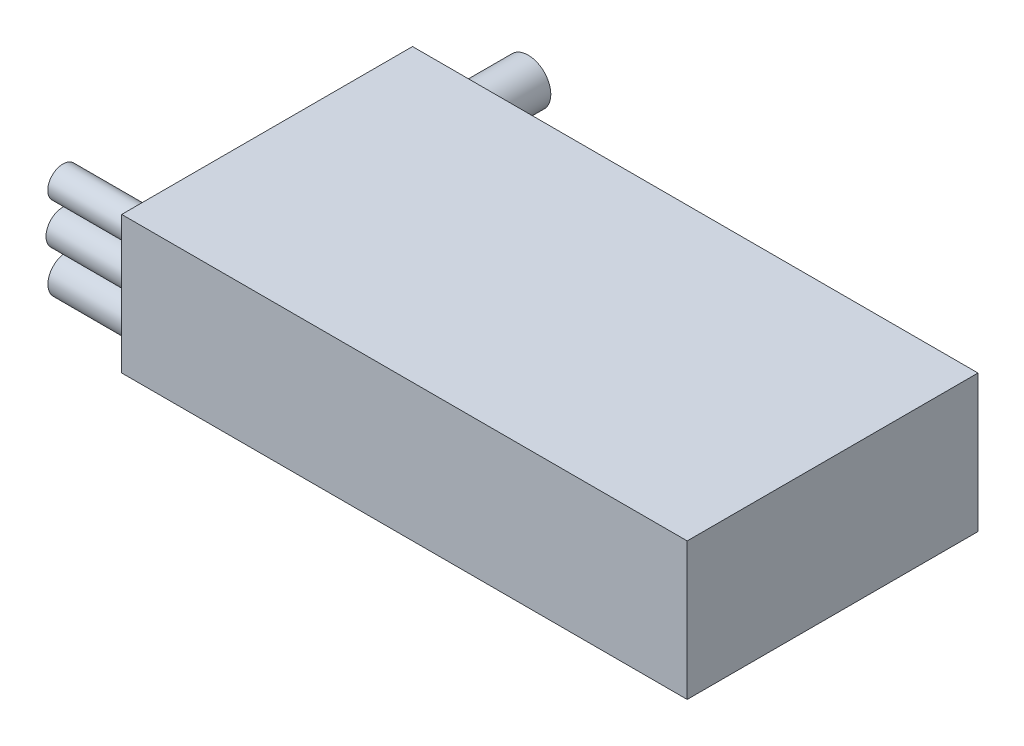
ISO-10303-21;
HEADER;
FILE_DESCRIPTION(('STEP AP214'),'2;1');
FILE_NAME('part.step','',(''),(''),'','','');
FILE_SCHEMA(('AUTOMOTIVE_DESIGN { 1 0 10303 214 1 1 1 1 }'));
ENDSEC;
DATA;
#1=APPLICATION_CONTEXT('core data for automotive mechanical design processes');
#2=APPLICATION_PROTOCOL_DEFINITION('international standard','automotive_design',2000,#1);
#3=PRODUCT_CONTEXT('',#1,'mechanical');
#4=PRODUCT('Part','Part','',(#3));
#5=PRODUCT_RELATED_PRODUCT_CATEGORY('part','',(#4));
#6=PRODUCT_DEFINITION_FORMATION('','',#4);
#7=PRODUCT_DEFINITION_CONTEXT('part definition',#1,'design');
#8=PRODUCT_DEFINITION('design','',#6,#7);
#9=PRODUCT_DEFINITION_SHAPE('','',#8);
#10=(LENGTH_UNIT() NAMED_UNIT(*) SI_UNIT(.MILLI.,.METRE.));
#11=(NAMED_UNIT(*) PLANE_ANGLE_UNIT() SI_UNIT($,.RADIAN.));
#12=(NAMED_UNIT(*) SI_UNIT($,.STERADIAN.) SOLID_ANGLE_UNIT());
#13=UNCERTAINTY_MEASURE_WITH_UNIT(LENGTH_MEASURE(1.E-05),#10,'distance_accuracy_value','');
#14=(GEOMETRIC_REPRESENTATION_CONTEXT(3) GLOBAL_UNCERTAINTY_ASSIGNED_CONTEXT((#13)) GLOBAL_UNIT_ASSIGNED_CONTEXT((#10,
#11,#12)) REPRESENTATION_CONTEXT('',''));
#15=CARTESIAN_POINT('',(0.,0.,0.));
#16=DIRECTION('',(0.,0.,1.));
#17=DIRECTION('',(1.,0.,0.));
#18=AXIS2_PLACEMENT_3D('',#15,#16,#17);
#19=CARTESIAN_POINT('',(35.,17.,-18.));
#20=DIRECTION('',(-1.,0.,0.));
#21=DIRECTION('',(0.,0.,1.));
#22=AXIS2_PLACEMENT_3D('',#19,#20,#21);
#23=PLANE('',#22);
#24=DIRECTION('',(0.,0.,-1.));
#25=VECTOR('',#24,1.);
#26=CARTESIAN_POINT('',(35.,0.,-18.));
#27=LINE('',#26,#25);
#28=CARTESIAN_POINT('',(35.,0.,18.));
#29=VERTEX_POINT('',#28);
#30=CARTESIAN_POINT('',(35.,0.,-18.));
#31=VERTEX_POINT('',#30);
#32=EDGE_CURVE('E102',#29,#31,#27,.T.);
#33=ORIENTED_EDGE('',*,*,#32,.T.);
#34=DIRECTION('',(0.,-1.,0.));
#35=VECTOR('',#34,1.);
#36=CARTESIAN_POINT('',(35.,17.,-18.));
#37=LINE('',#36,#35);
#38=CARTESIAN_POINT('',(35.,17.,-18.));
#39=VERTEX_POINT('',#38);
#40=EDGE_CURVE('E93',#39,#31,#37,.T.);
#41=ORIENTED_EDGE('',*,*,#40,.F.);
#42=DIRECTION('',(0.,0.,-1.));
#43=VECTOR('',#42,1.);
#44=CARTESIAN_POINT('',(35.,17.,-18.));
#45=LINE('',#44,#43);
#46=CARTESIAN_POINT('',(35.,17.,18.));
#47=VERTEX_POINT('',#46);
#48=EDGE_CURVE('E87',#47,#39,#45,.T.);
#49=ORIENTED_EDGE('',*,*,#48,.F.);
#50=DIRECTION('',(0.,-1.,0.));
#51=VECTOR('',#50,1.);
#52=CARTESIAN_POINT('',(35.,17.,18.));
#53=LINE('',#52,#51);
#54=EDGE_CURVE('E98',#47,#29,#53,.T.);
#55=ORIENTED_EDGE('',*,*,#54,.T.);
#56=EDGE_LOOP('',(#33,#41,#49,#55));
#57=FACE_BOUND('',#56,.T.);
#58=ADVANCED_FACE('F35',(#57),#23,.F.);
#59=CARTESIAN_POINT('',(-35.,17.,-18.));
#60=DIRECTION('',(0.,0.,1.));
#61=DIRECTION('',(1.,0.,0.));
#62=AXIS2_PLACEMENT_3D('',#59,#60,#61);
#63=PLANE('',#62);
#64=CARTESIAN_POINT('',(-30.6831813363715,10.43392197505,-18.));
#65=DIRECTION('',(0.,0.,1.));
#66=DIRECTION('',(1.,0.,0.));
#67=AXIS2_PLACEMENT_3D('',#64,#65,#66);
#68=CIRCLE('',#67,2.80223485203973);
#69=CARTESIAN_POINT('',(-27.8809464843318,10.43392197505,-18.));
#70=VERTEX_POINT('',#69);
#71=EDGE_CURVE('E11',#70,#70,#68,.F.);
#72=ORIENTED_EDGE('',*,*,#71,.F.);
#73=EDGE_LOOP('',(#72));
#74=FACE_BOUND('',#73,.T.);
#75=CARTESIAN_POINT('',(-31.1060316217322,3.88585075859282,-18.));
#76=DIRECTION('',(0.,0.,1.));
#77=DIRECTION('',(1.,0.,0.));
#78=AXIS2_PLACEMENT_3D('',#75,#76,#77);
#79=CIRCLE('',#78,2.61421603508773);
#80=CARTESIAN_POINT('',(-28.4918155866445,3.88585075859282,-18.));
#81=VERTEX_POINT('',#80);
#82=EDGE_CURVE('E43',#81,#81,#79,.F.);
#83=ORIENTED_EDGE('',*,*,#82,.F.);
#84=EDGE_LOOP('',(#83));
#85=FACE_BOUND('',#84,.T.);
#86=DIRECTION('',(-1.,0.,0.));
#87=VECTOR('',#86,1.);
#88=CARTESIAN_POINT('',(-35.,0.,-18.));
#89=LINE('',#88,#87);
#90=CARTESIAN_POINT('',(-35.,0.,-18.));
#91=VERTEX_POINT('',#90);
#92=EDGE_CURVE('E92',#31,#91,#89,.T.);
#93=ORIENTED_EDGE('',*,*,#92,.T.);
#94=DIRECTION('',(0.,-1.,0.));
#95=VECTOR('',#94,1.);
#96=CARTESIAN_POINT('',(-35.,17.,-18.));
#97=LINE('',#96,#95);
#98=CARTESIAN_POINT('',(-35.,17.,-18.));
#99=VERTEX_POINT('',#98);
#100=EDGE_CURVE('E90',#99,#91,#97,.T.);
#101=ORIENTED_EDGE('',*,*,#100,.F.);
#102=DIRECTION('',(-1.,0.,0.));
#103=VECTOR('',#102,1.);
#104=CARTESIAN_POINT('',(-35.,17.,-18.));
#105=LINE('',#104,#103);
#106=EDGE_CURVE('E82',#39,#99,#105,.T.);
#107=ORIENTED_EDGE('',*,*,#106,.F.);
#108=ORIENTED_EDGE('',*,*,#40,.T.);
#109=EDGE_LOOP('',(#93,#101,#107,#108));
#110=FACE_BOUND('',#109,.T.);
#111=ADVANCED_FACE('F91',(#74,#85,#110),#63,.F.);
#112=CARTESIAN_POINT('',(-35.,17.,-18.));
#113=DIRECTION('',(1.,0.,0.));
#114=DIRECTION('',(0.,0.,-1.));
#115=AXIS2_PLACEMENT_3D('',#112,#113,#114);
#116=PLANE('',#115);
#117=CARTESIAN_POINT('',(-35.,4.07487199441192,14.8217700300748));
#118=DIRECTION('',(1.,0.,0.));
#119=DIRECTION('',(0.,0.,-1.));
#120=AXIS2_PLACEMENT_3D('',#117,#118,#119);
#121=CIRCLE('',#120,2.31903959054969);
#122=CARTESIAN_POINT('',(-35.,4.07487199441192,12.5027304395251));
#123=VERTEX_POINT('',#122);
#124=EDGE_CURVE('E118',#123,#123,#121,.F.);
#125=ORIENTED_EDGE('',*,*,#124,.F.);
#126=EDGE_LOOP('',(#125));
#127=FACE_BOUND('',#126,.T.);
#128=CARTESIAN_POINT('',(-35.,9.3322426357787,15.2748593044176));
#129=DIRECTION('',(1.,0.,0.));
#130=DIRECTION('',(0.,0.,-1.));
#131=AXIS2_PLACEMENT_3D('',#128,#129,#130);
#132=CIRCLE('',#131,2.09803539287678);
#133=CARTESIAN_POINT('',(-35.,9.3322426357787,13.1768239115409));
#134=VERTEX_POINT('',#133);
#135=EDGE_CURVE('E115',#134,#134,#132,.F.);
#136=ORIENTED_EDGE('',*,*,#135,.F.);
#137=EDGE_LOOP('',(#136));
#138=FACE_BOUND('',#137,.T.);
#139=CARTESIAN_POINT('',(-35.,14.1664300806639,15.2748593044176));
#140=DIRECTION('',(1.,0.,0.));
#141=DIRECTION('',(0.,0.,-1.));
#142=AXIS2_PLACEMENT_3D('',#139,#140,#141);
#143=CIRCLE('',#142,1.88055746713924);
#144=CARTESIAN_POINT('',(-35.,14.1664300806639,13.3943018372784));
#145=VERTEX_POINT('',#144);
#146=EDGE_CURVE('E112',#145,#145,#143,.F.);
#147=ORIENTED_EDGE('',*,*,#146,.F.);
#148=EDGE_LOOP('',(#147));
#149=FACE_BOUND('',#148,.T.);
#150=DIRECTION('',(0.,0.,1.));
#151=VECTOR('',#150,1.);
#152=CARTESIAN_POINT('',(-35.,0.,-18.));
#153=LINE('',#152,#151);
#154=CARTESIAN_POINT('',(-35.,0.,18.));
#155=VERTEX_POINT('',#154);
#156=EDGE_CURVE('E68',#91,#155,#153,.T.);
#157=ORIENTED_EDGE('',*,*,#156,.T.);
#158=DIRECTION('',(0.,-1.,0.));
#159=VECTOR('',#158,1.);
#160=CARTESIAN_POINT('',(-35.,17.,18.));
#161=LINE('',#160,#159);
#162=CARTESIAN_POINT('',(-35.,17.,18.));
#163=VERTEX_POINT('',#162);
#164=EDGE_CURVE('E94',#163,#155,#161,.T.);
#165=ORIENTED_EDGE('',*,*,#164,.F.);
#166=DIRECTION('',(0.,0.,1.));
#167=VECTOR('',#166,1.);
#168=CARTESIAN_POINT('',(-35.,17.,-18.));
#169=LINE('',#168,#167);
#170=EDGE_CURVE('E85',#99,#163,#169,.T.);
#171=ORIENTED_EDGE('',*,*,#170,.F.);
#172=ORIENTED_EDGE('',*,*,#100,.T.);
#173=EDGE_LOOP('',(#157,#165,#171,#172));
#174=FACE_BOUND('',#173,.T.);
#175=ADVANCED_FACE('F96',(#127,#138,#149,#174),#116,.F.);
#176=CARTESIAN_POINT('',(-35.,17.,18.));
#177=DIRECTION('',(0.,0.,-1.));
#178=DIRECTION('',(-1.,0.,0.));
#179=AXIS2_PLACEMENT_3D('',#176,#177,#178);
#180=PLANE('',#179);
#181=DIRECTION('',(1.,0.,0.));
#182=VECTOR('',#181,1.);
#183=CARTESIAN_POINT('',(-35.,0.,18.));
#184=LINE('',#183,#182);
#185=EDGE_CURVE('E74',#155,#29,#184,.T.);
#186=ORIENTED_EDGE('',*,*,#185,.T.);
#187=ORIENTED_EDGE('',*,*,#54,.F.);
#188=DIRECTION('',(1.,0.,0.));
#189=VECTOR('',#188,1.);
#190=CARTESIAN_POINT('',(-35.,17.,18.));
#191=LINE('',#190,#189);
#192=EDGE_CURVE('E51',#163,#47,#191,.T.);
#193=ORIENTED_EDGE('',*,*,#192,.F.);
#194=ORIENTED_EDGE('',*,*,#164,.T.);
#195=EDGE_LOOP('',(#186,#187,#193,#194));
#196=FACE_BOUND('',#195,.T.);
#197=ADVANCED_FACE('F132',(#196),#180,.F.);
#198=CARTESIAN_POINT('',(0.,17.,0.));
#199=DIRECTION('',(0.,1.,0.));
#200=DIRECTION('',(0.,0.,1.));
#201=AXIS2_PLACEMENT_3D('',#198,#199,#200);
#202=PLANE('',#201);
#203=ORIENTED_EDGE('',*,*,#48,.T.);
#204=ORIENTED_EDGE('',*,*,#106,.T.);
#205=ORIENTED_EDGE('',*,*,#170,.T.);
#206=ORIENTED_EDGE('',*,*,#192,.T.);
#207=EDGE_LOOP('',(#203,#204,#205,#206));
#208=FACE_BOUND('',#207,.T.);
#209=ADVANCED_FACE('F83',(#208),#202,.T.);
#210=CARTESIAN_POINT('',(0.,0.,0.));
#211=DIRECTION('',(0.,1.,0.));
#212=DIRECTION('',(0.,0.,1.));
#213=AXIS2_PLACEMENT_3D('',#210,#211,#212);
#214=PLANE('',#213);
#215=ORIENTED_EDGE('',*,*,#32,.F.);
#216=ORIENTED_EDGE('',*,*,#185,.F.);
#217=ORIENTED_EDGE('',*,*,#156,.F.);
#218=ORIENTED_EDGE('',*,*,#92,.F.);
#219=EDGE_LOOP('',(#215,#216,#217,#218));
#220=FACE_BOUND('',#219,.T.);
#221=ADVANCED_FACE('F141',(#220),#214,.F.);
#222=CARTESIAN_POINT('',(-45.,14.1664300806639,15.2748593044176));
#223=DIRECTION('',(1.,0.,0.));
#224=DIRECTION('',(0.,0.,-1.));
#225=AXIS2_PLACEMENT_3D('',#222,#223,#224);
#226=CYLINDRICAL_SURFACE('',#225,1.88055746713924);
#227=CARTESIAN_POINT('',(-45.,14.1664300806639,15.2748593044176));
#228=DIRECTION('',(-1.,0.,0.));
#229=DIRECTION('',(0.,0.,1.));
#230=AXIS2_PLACEMENT_3D('',#227,#228,#229);
#231=CIRCLE('',#230,1.88055746713924);
#232=CARTESIAN_POINT('',(-45.,14.1664300806639,17.1554167715569));
#233=VERTEX_POINT('',#232);
#234=EDGE_CURVE('E105',#233,#233,#231,.T.);
#235=ORIENTED_EDGE('',*,*,#234,.F.);
#236=EDGE_LOOP('',(#235));
#237=FACE_BOUND('',#236,.T.);
#238=ORIENTED_EDGE('',*,*,#146,.T.);
#239=EDGE_LOOP('',(#238));
#240=FACE_BOUND('',#239,.T.);
#241=ADVANCED_FACE('F144',(#237,#240),#226,.T.);
#242=CARTESIAN_POINT('',(-45.,14.1664300806639,15.2748593044176));
#243=DIRECTION('',(-1.,0.,0.));
#244=DIRECTION('',(0.,0.,1.));
#245=AXIS2_PLACEMENT_3D('',#242,#243,#244);
#246=PLANE('',#245);
#247=ORIENTED_EDGE('',*,*,#234,.T.);
#248=EDGE_LOOP('',(#247));
#249=FACE_BOUND('',#248,.T.);
#250=ADVANCED_FACE('F150',(#249),#246,.T.);
#251=CARTESIAN_POINT('',(-45.,9.3322426357787,15.2748593044176));
#252=DIRECTION('',(1.,0.,0.));
#253=DIRECTION('',(0.,0.,-1.));
#254=AXIS2_PLACEMENT_3D('',#251,#252,#253);
#255=CYLINDRICAL_SURFACE('',#254,2.09803539287678);
#256=CARTESIAN_POINT('',(-45.,9.3322426357787,15.2748593044176));
#257=DIRECTION('',(-1.,0.,0.));
#258=DIRECTION('',(0.,0.,1.));
#259=AXIS2_PLACEMENT_3D('',#256,#257,#258);
#260=CIRCLE('',#259,2.09803539287678);
#261=CARTESIAN_POINT('',(-45.,9.3322426357787,17.3728946972944));
#262=VERTEX_POINT('',#261);
#263=EDGE_CURVE('E198',#262,#262,#260,.T.);
#264=ORIENTED_EDGE('',*,*,#263,.F.);
#265=EDGE_LOOP('',(#264));
#266=FACE_BOUND('',#265,.T.);
#267=ORIENTED_EDGE('',*,*,#135,.T.);
#268=EDGE_LOOP('',(#267));
#269=FACE_BOUND('',#268,.T.);
#270=ADVANCED_FACE('F154',(#266,#269),#255,.T.);
#271=CARTESIAN_POINT('',(-45.,9.3322426357787,15.2748593044176));
#272=DIRECTION('',(-1.,0.,0.));
#273=DIRECTION('',(0.,0.,1.));
#274=AXIS2_PLACEMENT_3D('',#271,#272,#273);
#275=PLANE('',#274);
#276=ORIENTED_EDGE('',*,*,#263,.T.);
#277=EDGE_LOOP('',(#276));
#278=FACE_BOUND('',#277,.T.);
#279=ADVANCED_FACE('F158',(#278),#275,.T.);
#280=CARTESIAN_POINT('',(-45.,4.07487199441192,14.8217700300748));
#281=DIRECTION('',(1.,0.,0.));
#282=DIRECTION('',(0.,0.,-1.));
#283=AXIS2_PLACEMENT_3D('',#280,#281,#282);
#284=CYLINDRICAL_SURFACE('',#283,2.31903959054969);
#285=CARTESIAN_POINT('',(-45.,4.07487199441192,14.8217700300748));
#286=DIRECTION('',(-1.,0.,0.));
#287=DIRECTION('',(0.,0.,1.));
#288=AXIS2_PLACEMENT_3D('',#285,#286,#287);
#289=CIRCLE('',#288,2.31903959054969);
#290=CARTESIAN_POINT('',(-45.,4.07487199441192,17.1408096206245));
#291=VERTEX_POINT('',#290);
#292=EDGE_CURVE('E193',#291,#291,#289,.T.);
#293=ORIENTED_EDGE('',*,*,#292,.F.);
#294=EDGE_LOOP('',(#293));
#295=FACE_BOUND('',#294,.T.);
#296=ORIENTED_EDGE('',*,*,#124,.T.);
#297=EDGE_LOOP('',(#296));
#298=FACE_BOUND('',#297,.T.);
#299=ADVANCED_FACE('F162',(#295,#298),#284,.T.);
#300=CARTESIAN_POINT('',(-45.,4.07487199441192,14.8217700300748));
#301=DIRECTION('',(-1.,0.,0.));
#302=DIRECTION('',(0.,0.,1.));
#303=AXIS2_PLACEMENT_3D('',#300,#301,#302);
#304=PLANE('',#303);
#305=ORIENTED_EDGE('',*,*,#292,.T.);
#306=EDGE_LOOP('',(#305));
#307=FACE_BOUND('',#306,.T.);
#308=ADVANCED_FACE('F166',(#307),#304,.T.);
#309=CARTESIAN_POINT('',(-31.1060316217322,3.88585075859282,-28.));
#310=DIRECTION('',(0.,0.,1.));
#311=DIRECTION('',(1.,0.,0.));
#312=AXIS2_PLACEMENT_3D('',#309,#310,#311);
#313=CYLINDRICAL_SURFACE('',#312,2.61421603508773);
#314=CARTESIAN_POINT('',(-31.1060316217322,3.88585075859282,-28.));
#315=DIRECTION('',(0.,0.,-1.));
#316=DIRECTION('',(-1.,0.,0.));
#317=AXIS2_PLACEMENT_3D('',#314,#315,#316);
#318=CIRCLE('',#317,2.61421603508773);
#319=CARTESIAN_POINT('',(-33.7202476568199,3.88585075859282,-28.));
#320=VERTEX_POINT('',#319);
#321=EDGE_CURVE('E190',#320,#320,#318,.T.);
#322=ORIENTED_EDGE('',*,*,#321,.F.);
#323=EDGE_LOOP('',(#322));
#324=FACE_BOUND('',#323,.T.);
#325=ORIENTED_EDGE('',*,*,#82,.T.);
#326=EDGE_LOOP('',(#325));
#327=FACE_BOUND('',#326,.T.);
#328=ADVANCED_FACE('F123',(#324,#327),#313,.T.);
#329=CARTESIAN_POINT('',(-31.1060316217322,3.88585075859282,-28.));
#330=DIRECTION('',(0.,0.,-1.));
#331=DIRECTION('',(-1.,0.,0.));
#332=AXIS2_PLACEMENT_3D('',#329,#330,#331);
#333=PLANE('',#332);
#334=ORIENTED_EDGE('',*,*,#321,.T.);
#335=EDGE_LOOP('',(#334));
#336=FACE_BOUND('',#335,.T.);
#337=ADVANCED_FACE('F173',(#336),#333,.T.);
#338=CARTESIAN_POINT('',(-30.6831813363715,10.43392197505,-28.));
#339=DIRECTION('',(0.,0.,1.));
#340=DIRECTION('',(1.,0.,0.));
#341=AXIS2_PLACEMENT_3D('',#338,#339,#340);
#342=CYLINDRICAL_SURFACE('',#341,2.80223485203973);
#343=CARTESIAN_POINT('',(-30.6831813363715,10.43392197505,-28.));
#344=DIRECTION('',(0.,0.,-1.));
#345=DIRECTION('',(-1.,0.,0.));
#346=AXIS2_PLACEMENT_3D('',#343,#344,#345);
#347=CIRCLE('',#346,2.80223485203973);
#348=CARTESIAN_POINT('',(-33.4854161884112,10.43392197505,-28.));
#349=VERTEX_POINT('',#348);
#350=EDGE_CURVE('E189',#349,#349,#347,.T.);
#351=ORIENTED_EDGE('',*,*,#350,.F.);
#352=EDGE_LOOP('',(#351));
#353=FACE_BOUND('',#352,.T.);
#354=ORIENTED_EDGE('',*,*,#71,.T.);
#355=EDGE_LOOP('',(#354));
#356=FACE_BOUND('',#355,.T.);
#357=ADVANCED_FACE('F177',(#353,#356),#342,.T.);
#358=CARTESIAN_POINT('',(-30.6831813363715,10.43392197505,-28.));
#359=DIRECTION('',(0.,0.,-1.));
#360=DIRECTION('',(-1.,0.,0.));
#361=AXIS2_PLACEMENT_3D('',#358,#359,#360);
#362=PLANE('',#361);
#363=ORIENTED_EDGE('',*,*,#350,.T.);
#364=EDGE_LOOP('',(#363));
#365=FACE_BOUND('',#364,.T.);
#366=ADVANCED_FACE('F181',(#365),#362,.T.);
#367=CLOSED_SHELL('',(#58,#111,#175,#197,#209,#221,#241,#250,#270,#279,#299,#308,#328,#337,#357,#366));
#368=MANIFOLD_SOLID_BREP('B2',#367);
#369=ADVANCED_BREP_SHAPE_REPRESENTATION('',(#18,#368),#14);
#370=SHAPE_DEFINITION_REPRESENTATION(#9,#369);
ENDSEC;
END-ISO-10303-21;
